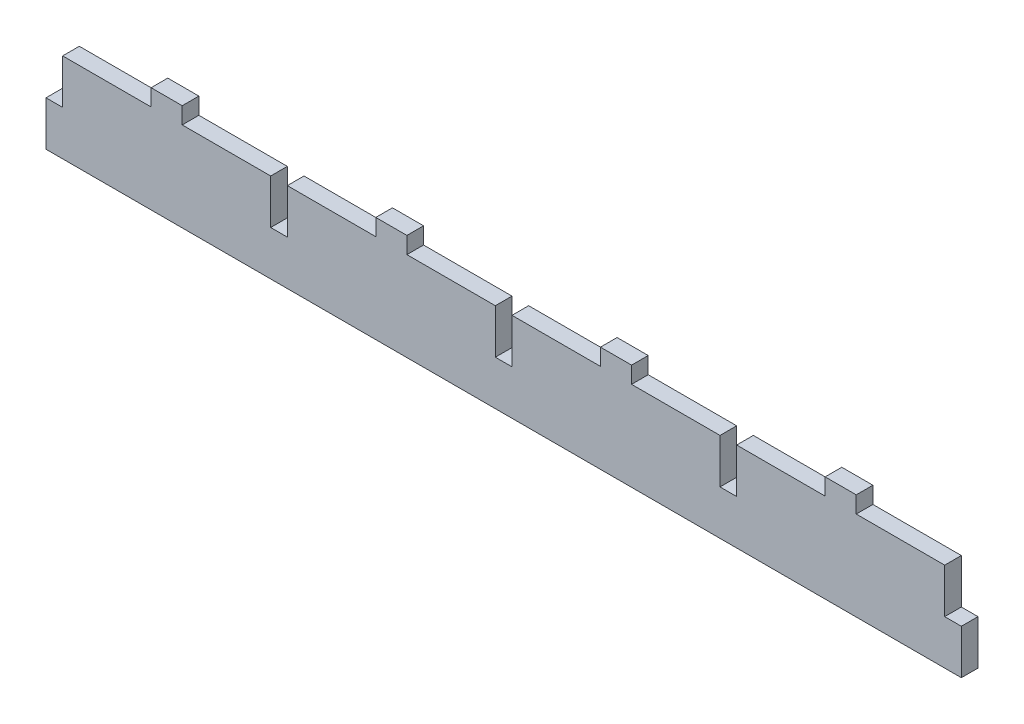
ISO-10303-21;
HEADER;
FILE_DESCRIPTION(('STEP AP214'),'2;1');
FILE_NAME('part.step','',(''),(''),'','','');
FILE_SCHEMA(('AUTOMOTIVE_DESIGN { 1 0 10303 214 1 1 1 1 }'));
ENDSEC;
DATA;
#1=APPLICATION_CONTEXT('core data for automotive mechanical design processes');
#2=APPLICATION_PROTOCOL_DEFINITION('international standard','automotive_design',2000,#1);
#3=PRODUCT_CONTEXT('',#1,'mechanical');
#4=PRODUCT('Part','Part','',(#3));
#5=PRODUCT_RELATED_PRODUCT_CATEGORY('part','',(#4));
#6=PRODUCT_DEFINITION_FORMATION('','',#4);
#7=PRODUCT_DEFINITION_CONTEXT('part definition',#1,'design');
#8=PRODUCT_DEFINITION('design','',#6,#7);
#9=PRODUCT_DEFINITION_SHAPE('','',#8);
#10=(LENGTH_UNIT() NAMED_UNIT(*) SI_UNIT(.MILLI.,.METRE.));
#11=(NAMED_UNIT(*) PLANE_ANGLE_UNIT() SI_UNIT($,.RADIAN.));
#12=(NAMED_UNIT(*) SI_UNIT($,.STERADIAN.) SOLID_ANGLE_UNIT());
#13=UNCERTAINTY_MEASURE_WITH_UNIT(LENGTH_MEASURE(1.E-05),#10,'distance_accuracy_value','');
#14=(GEOMETRIC_REPRESENTATION_CONTEXT(3) GLOBAL_UNCERTAINTY_ASSIGNED_CONTEXT((#13)) GLOBAL_UNIT_ASSIGNED_CONTEXT((#10,
#11,#12)) REPRESENTATION_CONTEXT('',''));
#15=CARTESIAN_POINT('',(0.,0.,0.));
#16=DIRECTION('',(0.,0.,1.));
#17=DIRECTION('',(1.,0.,0.));
#18=AXIS2_PLACEMENT_3D('',#15,#16,#17);
#19=CARTESIAN_POINT('',(-147.,0.,5.35));
#20=DIRECTION('',(1.,0.,0.));
#21=DIRECTION('',(0.,0.,-1.));
#22=AXIS2_PLACEMENT_3D('',#19,#20,#21);
#23=PLANE('',#22);
#24=DIRECTION('',(0.,-1.,0.));
#25=VECTOR('',#24,1.);
#26=CARTESIAN_POINT('',(-147.,0.,0.));
#27=LINE('',#26,#25);
#28=CARTESIAN_POINT('',(-147.,14.32,0.));
#29=VERTEX_POINT('',#28);
#30=CARTESIAN_POINT('',(-147.,0.,0.));
#31=VERTEX_POINT('',#30);
#32=EDGE_CURVE('E296',#29,#31,#27,.T.);
#33=ORIENTED_EDGE('',*,*,#32,.T.);
#34=DIRECTION('',(0.,0.,-1.));
#35=VECTOR('',#34,1.);
#36=CARTESIAN_POINT('',(-147.,0.,5.35));
#37=LINE('',#36,#35);
#38=CARTESIAN_POINT('',(-147.,0.,5.35));
#39=VERTEX_POINT('',#38);
#40=EDGE_CURVE('E11',#39,#31,#37,.T.);
#41=ORIENTED_EDGE('',*,*,#40,.F.);
#42=DIRECTION('',(0.,-1.,0.));
#43=VECTOR('',#42,1.);
#44=CARTESIAN_POINT('',(-147.,0.,5.35));
#45=LINE('',#44,#43);
#46=CARTESIAN_POINT('',(-147.,14.32,5.35));
#47=VERTEX_POINT('',#46);
#48=EDGE_CURVE('E366',#47,#39,#45,.T.);
#49=ORIENTED_EDGE('',*,*,#48,.F.);
#50=DIRECTION('',(0.,0.,-1.));
#51=VECTOR('',#50,1.);
#52=CARTESIAN_POINT('',(-147.,14.32,5.35));
#53=LINE('',#52,#51);
#54=EDGE_CURVE('E292',#47,#29,#53,.T.);
#55=ORIENTED_EDGE('',*,*,#54,.T.);
#56=EDGE_LOOP('',(#33,#41,#49,#55));
#57=FACE_BOUND('',#56,.T.);
#58=ADVANCED_FACE('F32',(#57),#23,.F.);
#59=CARTESIAN_POINT('',(-147.,0.,5.35));
#60=DIRECTION('',(0.,1.,0.));
#61=DIRECTION('',(0.,0.,1.));
#62=AXIS2_PLACEMENT_3D('',#59,#60,#61);
#63=PLANE('',#62);
#64=DIRECTION('',(1.,0.,0.));
#65=VECTOR('',#64,1.);
#66=CARTESIAN_POINT('',(-147.,0.,0.));
#67=LINE('',#66,#65);
#68=CARTESIAN_POINT('',(147.,0.,0.));
#69=VERTEX_POINT('',#68);
#70=EDGE_CURVE('E299',#31,#69,#67,.T.);
#71=ORIENTED_EDGE('',*,*,#70,.T.);
#72=DIRECTION('',(0.,0.,-1.));
#73=VECTOR('',#72,1.);
#74=CARTESIAN_POINT('',(147.,0.,5.35));
#75=LINE('',#74,#73);
#76=CARTESIAN_POINT('',(147.,0.,5.35));
#77=VERTEX_POINT('',#76);
#78=EDGE_CURVE('E40',#77,#69,#75,.T.);
#79=ORIENTED_EDGE('',*,*,#78,.F.);
#80=DIRECTION('',(1.,0.,0.));
#81=VECTOR('',#80,1.);
#82=CARTESIAN_POINT('',(-147.,0.,5.35));
#83=LINE('',#82,#81);
#84=EDGE_CURVE('E175',#39,#77,#83,.T.);
#85=ORIENTED_EDGE('',*,*,#84,.F.);
#86=ORIENTED_EDGE('',*,*,#40,.T.);
#87=EDGE_LOOP('',(#71,#79,#85,#86));
#88=FACE_BOUND('',#87,.T.);
#89=ADVANCED_FACE('F564',(#88),#63,.F.);
#90=CARTESIAN_POINT('',(147.,0.,5.35));
#91=DIRECTION('',(-1.,0.,0.));
#92=DIRECTION('',(0.,0.,1.));
#93=AXIS2_PLACEMENT_3D('',#90,#91,#92);
#94=PLANE('',#93);
#95=DIRECTION('',(0.,1.,0.));
#96=VECTOR('',#95,1.);
#97=CARTESIAN_POINT('',(147.,0.,0.));
#98=LINE('',#97,#96);
#99=CARTESIAN_POINT('',(147.,14.32,0.));
#100=VERTEX_POINT('',#99);
#101=EDGE_CURVE('E301',#69,#100,#98,.T.);
#102=ORIENTED_EDGE('',*,*,#101,.T.);
#103=DIRECTION('',(0.,0.,-1.));
#104=VECTOR('',#103,1.);
#105=CARTESIAN_POINT('',(147.,14.32,5.35));
#106=LINE('',#105,#104);
#107=CARTESIAN_POINT('',(147.,14.32,5.35));
#108=VERTEX_POINT('',#107);
#109=EDGE_CURVE('E457',#108,#100,#106,.T.);
#110=ORIENTED_EDGE('',*,*,#109,.F.);
#111=DIRECTION('',(0.,1.,0.));
#112=VECTOR('',#111,1.);
#113=CARTESIAN_POINT('',(147.,0.,5.35));
#114=LINE('',#113,#112);
#115=EDGE_CURVE('E465',#77,#108,#114,.T.);
#116=ORIENTED_EDGE('',*,*,#115,.F.);
#117=ORIENTED_EDGE('',*,*,#78,.T.);
#118=EDGE_LOOP('',(#102,#110,#116,#117));
#119=FACE_BOUND('',#118,.T.);
#120=ADVANCED_FACE('F463',(#119),#94,.F.);
#121=CARTESIAN_POINT('',(147.,14.32,5.35));
#122=DIRECTION('',(0.,-1.,0.));
#123=DIRECTION('',(0.,0.,-1.));
#124=AXIS2_PLACEMENT_3D('',#121,#122,#123);
#125=PLANE('',#124);
#126=DIRECTION('',(-1.,0.,0.));
#127=VECTOR('',#126,1.);
#128=CARTESIAN_POINT('',(147.,14.32,0.));
#129=LINE('',#128,#127);
#130=CARTESIAN_POINT('',(141.65,14.32,0.));
#131=VERTEX_POINT('',#130);
#132=EDGE_CURVE('E303',#100,#131,#129,.T.);
#133=ORIENTED_EDGE('',*,*,#132,.T.);
#134=DIRECTION('',(0.,0.,-1.));
#135=VECTOR('',#134,1.);
#136=CARTESIAN_POINT('',(141.65,14.32,5.35));
#137=LINE('',#136,#135);
#138=CARTESIAN_POINT('',(141.65,14.32,5.35));
#139=VERTEX_POINT('',#138);
#140=EDGE_CURVE('E454',#139,#131,#137,.T.);
#141=ORIENTED_EDGE('',*,*,#140,.F.);
#142=DIRECTION('',(-1.,0.,0.));
#143=VECTOR('',#142,1.);
#144=CARTESIAN_POINT('',(147.,14.32,5.35));
#145=LINE('',#144,#143);
#146=EDGE_CURVE('E483',#108,#139,#145,.T.);
#147=ORIENTED_EDGE('',*,*,#146,.F.);
#148=ORIENTED_EDGE('',*,*,#109,.T.);
#149=EDGE_LOOP('',(#133,#141,#147,#148));
#150=FACE_BOUND('',#149,.T.);
#151=ADVANCED_FACE('F474',(#150),#125,.F.);
#152=CARTESIAN_POINT('',(141.65,14.32,5.35));
#153=DIRECTION('',(-1.,0.,0.));
#154=DIRECTION('',(0.,-1.,0.));
#155=AXIS2_PLACEMENT_3D('',#152,#153,#154);
#156=PLANE('',#155);
#157=DIRECTION('',(0.,1.,0.));
#158=VECTOR('',#157,1.);
#159=CARTESIAN_POINT('',(141.65,14.32,0.));
#160=LINE('',#159,#158);
#161=CARTESIAN_POINT('',(141.65,28.65,0.));
#162=VERTEX_POINT('',#161);
#163=EDGE_CURVE('E305',#131,#162,#160,.T.);
#164=ORIENTED_EDGE('',*,*,#163,.T.);
#165=DIRECTION('',(0.,0.,-1.));
#166=VECTOR('',#165,1.);
#167=CARTESIAN_POINT('',(141.65,28.65,5.35));
#168=LINE('',#167,#166);
#169=CARTESIAN_POINT('',(141.65,28.65,5.35));
#170=VERTEX_POINT('',#169);
#171=EDGE_CURVE('E451',#170,#162,#168,.T.);
#172=ORIENTED_EDGE('',*,*,#171,.F.);
#173=DIRECTION('',(0.,1.,0.));
#174=VECTOR('',#173,1.);
#175=CARTESIAN_POINT('',(141.65,14.32,5.35));
#176=LINE('',#175,#174);
#177=EDGE_CURVE('E480',#139,#170,#176,.T.);
#178=ORIENTED_EDGE('',*,*,#177,.F.);
#179=ORIENTED_EDGE('',*,*,#140,.T.);
#180=EDGE_LOOP('',(#164,#172,#178,#179));
#181=FACE_BOUND('',#180,.T.);
#182=ADVANCED_FACE('F478',(#181),#156,.F.);
#183=CARTESIAN_POINT('',(113.24375,28.65,5.35));
#184=DIRECTION('',(0.,-1.,0.));
#185=DIRECTION('',(0.,0.,-1.));
#186=AXIS2_PLACEMENT_3D('',#183,#184,#185);
#187=PLANE('',#186);
#188=DIRECTION('',(-1.,0.,0.));
#189=VECTOR('',#188,1.);
#190=CARTESIAN_POINT('',(113.24375,28.65,0.));
#191=LINE('',#190,#189);
#192=CARTESIAN_POINT('',(113.24375,28.65,0.));
#193=VERTEX_POINT('',#192);
#194=EDGE_CURVE('E307',#162,#193,#191,.T.);
#195=ORIENTED_EDGE('',*,*,#194,.T.);
#196=DIRECTION('',(0.,0.,-1.));
#197=VECTOR('',#196,1.);
#198=CARTESIAN_POINT('',(113.24375,28.65,5.35));
#199=LINE('',#198,#197);
#200=CARTESIAN_POINT('',(113.24375,28.65,5.35));
#201=VERTEX_POINT('',#200);
#202=EDGE_CURVE('E448',#201,#193,#199,.T.);
#203=ORIENTED_EDGE('',*,*,#202,.F.);
#204=DIRECTION('',(-1.,0.,0.));
#205=VECTOR('',#204,1.);
#206=CARTESIAN_POINT('',(113.24375,28.65,5.35));
#207=LINE('',#206,#205);
#208=EDGE_CURVE('E482',#170,#201,#207,.T.);
#209=ORIENTED_EDGE('',*,*,#208,.F.);
#210=ORIENTED_EDGE('',*,*,#171,.T.);
#211=EDGE_LOOP('',(#195,#203,#209,#210));
#212=FACE_BOUND('',#211,.T.);
#213=ADVANCED_FACE('F577',(#212),#187,.F.);
#214=CARTESIAN_POINT('',(113.24375,28.65,5.35));
#215=DIRECTION('',(-1.,0.,0.));
#216=DIRECTION('',(0.,-1.,0.));
#217=AXIS2_PLACEMENT_3D('',#214,#215,#216);
#218=PLANE('',#217);
#219=DIRECTION('',(0.,1.,0.));
#220=VECTOR('',#219,1.);
#221=CARTESIAN_POINT('',(113.24375,28.65,0.));
#222=LINE('',#221,#220);
#223=CARTESIAN_POINT('',(113.24375,34.,0.));
#224=VERTEX_POINT('',#223);
#225=EDGE_CURVE('E309',#193,#224,#222,.T.);
#226=ORIENTED_EDGE('',*,*,#225,.T.);
#227=DIRECTION('',(0.,0.,-1.));
#228=VECTOR('',#227,1.);
#229=CARTESIAN_POINT('',(113.24375,34.,5.35));
#230=LINE('',#229,#228);
#231=CARTESIAN_POINT('',(113.24375,34.,5.35));
#232=VERTEX_POINT('',#231);
#233=EDGE_CURVE('E445',#232,#224,#230,.T.);
#234=ORIENTED_EDGE('',*,*,#233,.F.);
#235=DIRECTION('',(0.,1.,0.));
#236=VECTOR('',#235,1.);
#237=CARTESIAN_POINT('',(113.24375,28.65,5.35));
#238=LINE('',#237,#236);
#239=EDGE_CURVE('E485',#201,#232,#238,.T.);
#240=ORIENTED_EDGE('',*,*,#239,.F.);
#241=ORIENTED_EDGE('',*,*,#202,.T.);
#242=EDGE_LOOP('',(#226,#234,#240,#241));
#243=FACE_BOUND('',#242,.T.);
#244=ADVANCED_FACE('F580',(#243),#218,.F.);
#245=CARTESIAN_POINT('',(113.24375,34.,5.35));
#246=DIRECTION('',(0.,-1.,0.));
#247=DIRECTION('',(0.,0.,-1.));
#248=AXIS2_PLACEMENT_3D('',#245,#246,#247);
#249=PLANE('',#248);
#250=DIRECTION('',(-1.,0.,0.));
#251=VECTOR('',#250,1.);
#252=CARTESIAN_POINT('',(113.24375,34.,0.));
#253=LINE('',#252,#251);
#254=CARTESIAN_POINT('',(103.24375,34.,0.));
#255=VERTEX_POINT('',#254);
#256=EDGE_CURVE('E311',#224,#255,#253,.T.);
#257=ORIENTED_EDGE('',*,*,#256,.T.);
#258=DIRECTION('',(0.,0.,-1.));
#259=VECTOR('',#258,1.);
#260=CARTESIAN_POINT('',(103.24375,34.,5.35));
#261=LINE('',#260,#259);
#262=CARTESIAN_POINT('',(103.24375,34.,5.35));
#263=VERTEX_POINT('',#262);
#264=EDGE_CURVE('E442',#263,#255,#261,.T.);
#265=ORIENTED_EDGE('',*,*,#264,.F.);
#266=DIRECTION('',(-1.,0.,0.));
#267=VECTOR('',#266,1.);
#268=CARTESIAN_POINT('',(113.24375,34.,5.35));
#269=LINE('',#268,#267);
#270=EDGE_CURVE('E491',#232,#263,#269,.T.);
#271=ORIENTED_EDGE('',*,*,#270,.F.);
#272=ORIENTED_EDGE('',*,*,#233,.T.);
#273=EDGE_LOOP('',(#257,#265,#271,#272));
#274=FACE_BOUND('',#273,.T.);
#275=ADVANCED_FACE('F584',(#274),#249,.F.);
#276=CARTESIAN_POINT('',(103.24375,28.65,5.35));
#277=DIRECTION('',(1.,0.,0.));
#278=DIRECTION('',(0.,1.,0.));
#279=AXIS2_PLACEMENT_3D('',#276,#277,#278);
#280=PLANE('',#279);
#281=DIRECTION('',(0.,-1.,0.));
#282=VECTOR('',#281,1.);
#283=CARTESIAN_POINT('',(103.24375,28.65,0.));
#284=LINE('',#283,#282);
#285=CARTESIAN_POINT('',(103.24375,28.65,0.));
#286=VERTEX_POINT('',#285);
#287=EDGE_CURVE('E313',#255,#286,#284,.T.);
#288=ORIENTED_EDGE('',*,*,#287,.T.);
#289=DIRECTION('',(0.,0.,-1.));
#290=VECTOR('',#289,1.);
#291=CARTESIAN_POINT('',(103.24375,28.65,5.35));
#292=LINE('',#291,#290);
#293=CARTESIAN_POINT('',(103.24375,28.65,5.35));
#294=VERTEX_POINT('',#293);
#295=EDGE_CURVE('E439',#294,#286,#292,.T.);
#296=ORIENTED_EDGE('',*,*,#295,.F.);
#297=DIRECTION('',(0.,-1.,0.));
#298=VECTOR('',#297,1.);
#299=CARTESIAN_POINT('',(103.24375,28.65,5.35));
#300=LINE('',#299,#298);
#301=EDGE_CURVE('E493',#263,#294,#300,.T.);
#302=ORIENTED_EDGE('',*,*,#301,.F.);
#303=ORIENTED_EDGE('',*,*,#264,.T.);
#304=EDGE_LOOP('',(#288,#296,#302,#303));
#305=FACE_BOUND('',#304,.T.);
#306=ADVANCED_FACE('F588',(#305),#280,.F.);
#307=CARTESIAN_POINT('',(74.8375,28.65,5.35));
#308=DIRECTION('',(0.,-1.,0.));
#309=DIRECTION('',(0.,0.,-1.));
#310=AXIS2_PLACEMENT_3D('',#307,#308,#309);
#311=PLANE('',#310);
#312=DIRECTION('',(-1.,0.,0.));
#313=VECTOR('',#312,1.);
#314=CARTESIAN_POINT('',(74.8375,28.65,0.));
#315=LINE('',#314,#313);
#316=CARTESIAN_POINT('',(74.8375,28.65,0.));
#317=VERTEX_POINT('',#316);
#318=EDGE_CURVE('E315',#286,#317,#315,.T.);
#319=ORIENTED_EDGE('',*,*,#318,.T.);
#320=DIRECTION('',(0.,0.,-1.));
#321=VECTOR('',#320,1.);
#322=CARTESIAN_POINT('',(74.8375,28.65,5.35));
#323=LINE('',#322,#321);
#324=CARTESIAN_POINT('',(74.8375,28.65,5.35));
#325=VERTEX_POINT('',#324);
#326=EDGE_CURVE('E436',#325,#317,#323,.T.);
#327=ORIENTED_EDGE('',*,*,#326,.F.);
#328=DIRECTION('',(-1.,0.,0.));
#329=VECTOR('',#328,1.);
#330=CARTESIAN_POINT('',(74.8375,28.65,5.35));
#331=LINE('',#330,#329);
#332=EDGE_CURVE('E495',#294,#325,#331,.T.);
#333=ORIENTED_EDGE('',*,*,#332,.F.);
#334=ORIENTED_EDGE('',*,*,#295,.T.);
#335=EDGE_LOOP('',(#319,#327,#333,#334));
#336=FACE_BOUND('',#335,.T.);
#337=ADVANCED_FACE('F592',(#336),#311,.F.);
#338=CARTESIAN_POINT('',(74.8375,28.65,5.35));
#339=DIRECTION('',(1.,0.,0.));
#340=DIRECTION('',(0.,1.,0.));
#341=AXIS2_PLACEMENT_3D('',#338,#339,#340);
#342=PLANE('',#341);
#343=DIRECTION('',(0.,-1.,0.));
#344=VECTOR('',#343,1.);
#345=CARTESIAN_POINT('',(74.8375,28.65,0.));
#346=LINE('',#345,#344);
#347=CARTESIAN_POINT('',(74.8375,14.32,0.));
#348=VERTEX_POINT('',#347);
#349=EDGE_CURVE('E317',#317,#348,#346,.T.);
#350=ORIENTED_EDGE('',*,*,#349,.T.);
#351=DIRECTION('',(0.,0.,-1.));
#352=VECTOR('',#351,1.);
#353=CARTESIAN_POINT('',(74.8375,14.32,5.35));
#354=LINE('',#353,#352);
#355=CARTESIAN_POINT('',(74.8375,14.32,5.35));
#356=VERTEX_POINT('',#355);
#357=EDGE_CURVE('E433',#356,#348,#354,.T.);
#358=ORIENTED_EDGE('',*,*,#357,.F.);
#359=DIRECTION('',(0.,-1.,0.));
#360=VECTOR('',#359,1.);
#361=CARTESIAN_POINT('',(74.8375,28.65,5.35));
#362=LINE('',#361,#360);
#363=EDGE_CURVE('E497',#325,#356,#362,.T.);
#364=ORIENTED_EDGE('',*,*,#363,.F.);
#365=ORIENTED_EDGE('',*,*,#326,.T.);
#366=EDGE_LOOP('',(#350,#358,#364,#365));
#367=FACE_BOUND('',#366,.T.);
#368=ADVANCED_FACE('F596',(#367),#342,.F.);
#369=CARTESIAN_POINT('',(74.8375,14.32,5.35));
#370=DIRECTION('',(0.,-1.,0.));
#371=DIRECTION('',(0.,0.,-1.));
#372=AXIS2_PLACEMENT_3D('',#369,#370,#371);
#373=PLANE('',#372);
#374=DIRECTION('',(-1.,0.,0.));
#375=VECTOR('',#374,1.);
#376=CARTESIAN_POINT('',(74.8375,14.32,0.));
#377=LINE('',#376,#375);
#378=CARTESIAN_POINT('',(69.4875,14.32,0.));
#379=VERTEX_POINT('',#378);
#380=EDGE_CURVE('E319',#348,#379,#377,.T.);
#381=ORIENTED_EDGE('',*,*,#380,.T.);
#382=DIRECTION('',(0.,0.,-1.));
#383=VECTOR('',#382,1.);
#384=CARTESIAN_POINT('',(69.4875,14.32,5.35));
#385=LINE('',#384,#383);
#386=CARTESIAN_POINT('',(69.4875,14.32,5.35));
#387=VERTEX_POINT('',#386);
#388=EDGE_CURVE('E430',#387,#379,#385,.T.);
#389=ORIENTED_EDGE('',*,*,#388,.F.);
#390=DIRECTION('',(-1.,0.,0.));
#391=VECTOR('',#390,1.);
#392=CARTESIAN_POINT('',(74.8375,14.32,5.35));
#393=LINE('',#392,#391);
#394=EDGE_CURVE('E499',#356,#387,#393,.T.);
#395=ORIENTED_EDGE('',*,*,#394,.F.);
#396=ORIENTED_EDGE('',*,*,#357,.T.);
#397=EDGE_LOOP('',(#381,#389,#395,#396));
#398=FACE_BOUND('',#397,.T.);
#399=ADVANCED_FACE('F600',(#398),#373,.F.);
#400=CARTESIAN_POINT('',(69.4875,28.65,5.35));
#401=DIRECTION('',(-1.,0.,0.));
#402=DIRECTION('',(0.,0.,1.));
#403=AXIS2_PLACEMENT_3D('',#400,#401,#402);
#404=PLANE('',#403);
#405=DIRECTION('',(0.,1.,0.));
#406=VECTOR('',#405,1.);
#407=CARTESIAN_POINT('',(69.4875,28.65,0.));
#408=LINE('',#407,#406);
#409=CARTESIAN_POINT('',(69.4875,28.65,0.));
#410=VERTEX_POINT('',#409);
#411=EDGE_CURVE('E321',#379,#410,#408,.T.);
#412=ORIENTED_EDGE('',*,*,#411,.T.);
#413=DIRECTION('',(0.,0.,-1.));
#414=VECTOR('',#413,1.);
#415=CARTESIAN_POINT('',(69.4875,28.65,5.35));
#416=LINE('',#415,#414);
#417=CARTESIAN_POINT('',(69.4875,28.65,5.35));
#418=VERTEX_POINT('',#417);
#419=EDGE_CURVE('E427',#418,#410,#416,.T.);
#420=ORIENTED_EDGE('',*,*,#419,.F.);
#421=DIRECTION('',(0.,1.,0.));
#422=VECTOR('',#421,1.);
#423=CARTESIAN_POINT('',(69.4875,28.65,5.35));
#424=LINE('',#423,#422);
#425=EDGE_CURVE('E501',#387,#418,#424,.T.);
#426=ORIENTED_EDGE('',*,*,#425,.F.);
#427=ORIENTED_EDGE('',*,*,#388,.T.);
#428=EDGE_LOOP('',(#412,#420,#426,#427));
#429=FACE_BOUND('',#428,.T.);
#430=ADVANCED_FACE('F604',(#429),#404,.F.);
#431=CARTESIAN_POINT('',(41.08125,28.65,5.35));
#432=DIRECTION('',(0.,-1.,0.));
#433=DIRECTION('',(0.,0.,-1.));
#434=AXIS2_PLACEMENT_3D('',#431,#432,#433);
#435=PLANE('',#434);
#436=DIRECTION('',(-1.,0.,0.));
#437=VECTOR('',#436,1.);
#438=CARTESIAN_POINT('',(41.08125,28.65,0.));
#439=LINE('',#438,#437);
#440=CARTESIAN_POINT('',(41.08125,28.65,0.));
#441=VERTEX_POINT('',#440);
#442=EDGE_CURVE('E323',#410,#441,#439,.T.);
#443=ORIENTED_EDGE('',*,*,#442,.T.);
#444=DIRECTION('',(0.,0.,-1.));
#445=VECTOR('',#444,1.);
#446=CARTESIAN_POINT('',(41.08125,28.65,5.35));
#447=LINE('',#446,#445);
#448=CARTESIAN_POINT('',(41.08125,28.65,5.35));
#449=VERTEX_POINT('',#448);
#450=EDGE_CURVE('E424',#449,#441,#447,.T.);
#451=ORIENTED_EDGE('',*,*,#450,.F.);
#452=DIRECTION('',(-1.,0.,0.));
#453=VECTOR('',#452,1.);
#454=CARTESIAN_POINT('',(41.08125,28.65,5.35));
#455=LINE('',#454,#453);
#456=EDGE_CURVE('E503',#418,#449,#455,.T.);
#457=ORIENTED_EDGE('',*,*,#456,.F.);
#458=ORIENTED_EDGE('',*,*,#419,.T.);
#459=EDGE_LOOP('',(#443,#451,#457,#458));
#460=FACE_BOUND('',#459,.T.);
#461=ADVANCED_FACE('F608',(#460),#435,.F.);
#462=CARTESIAN_POINT('',(41.08125,28.65,5.35));
#463=DIRECTION('',(-1.,0.,0.));
#464=DIRECTION('',(0.,-1.,0.));
#465=AXIS2_PLACEMENT_3D('',#462,#463,#464);
#466=PLANE('',#465);
#467=DIRECTION('',(0.,1.,0.));
#468=VECTOR('',#467,1.);
#469=CARTESIAN_POINT('',(41.08125,28.65,0.));
#470=LINE('',#469,#468);
#471=CARTESIAN_POINT('',(41.08125,34.,0.));
#472=VERTEX_POINT('',#471);
#473=EDGE_CURVE('E325',#441,#472,#470,.T.);
#474=ORIENTED_EDGE('',*,*,#473,.T.);
#475=DIRECTION('',(0.,0.,-1.));
#476=VECTOR('',#475,1.);
#477=CARTESIAN_POINT('',(41.08125,34.,5.35));
#478=LINE('',#477,#476);
#479=CARTESIAN_POINT('',(41.08125,34.,5.35));
#480=VERTEX_POINT('',#479);
#481=EDGE_CURVE('E421',#480,#472,#478,.T.);
#482=ORIENTED_EDGE('',*,*,#481,.F.);
#483=DIRECTION('',(0.,1.,0.));
#484=VECTOR('',#483,1.);
#485=CARTESIAN_POINT('',(41.08125,28.65,5.35));
#486=LINE('',#485,#484);
#487=EDGE_CURVE('E505',#449,#480,#486,.T.);
#488=ORIENTED_EDGE('',*,*,#487,.F.);
#489=ORIENTED_EDGE('',*,*,#450,.T.);
#490=EDGE_LOOP('',(#474,#482,#488,#489));
#491=FACE_BOUND('',#490,.T.);
#492=ADVANCED_FACE('F612',(#491),#466,.F.);
#493=CARTESIAN_POINT('',(41.08125,34.,5.35));
#494=DIRECTION('',(0.,-1.,0.));
#495=DIRECTION('',(0.,0.,-1.));
#496=AXIS2_PLACEMENT_3D('',#493,#494,#495);
#497=PLANE('',#496);
#498=DIRECTION('',(-1.,0.,0.));
#499=VECTOR('',#498,1.);
#500=CARTESIAN_POINT('',(41.08125,34.,0.));
#501=LINE('',#500,#499);
#502=CARTESIAN_POINT('',(31.08125,34.,0.));
#503=VERTEX_POINT('',#502);
#504=EDGE_CURVE('E327',#472,#503,#501,.T.);
#505=ORIENTED_EDGE('',*,*,#504,.T.);
#506=DIRECTION('',(0.,0.,-1.));
#507=VECTOR('',#506,1.);
#508=CARTESIAN_POINT('',(31.08125,34.,5.35));
#509=LINE('',#508,#507);
#510=CARTESIAN_POINT('',(31.08125,34.,5.35));
#511=VERTEX_POINT('',#510);
#512=EDGE_CURVE('E418',#511,#503,#509,.T.);
#513=ORIENTED_EDGE('',*,*,#512,.F.);
#514=DIRECTION('',(-1.,0.,0.));
#515=VECTOR('',#514,1.);
#516=CARTESIAN_POINT('',(41.08125,34.,5.35));
#517=LINE('',#516,#515);
#518=EDGE_CURVE('E507',#480,#511,#517,.T.);
#519=ORIENTED_EDGE('',*,*,#518,.F.);
#520=ORIENTED_EDGE('',*,*,#481,.T.);
#521=EDGE_LOOP('',(#505,#513,#519,#520));
#522=FACE_BOUND('',#521,.T.);
#523=ADVANCED_FACE('F616',(#522),#497,.F.);
#524=CARTESIAN_POINT('',(31.08125,28.65,5.35));
#525=DIRECTION('',(1.,0.,0.));
#526=DIRECTION('',(0.,1.,0.));
#527=AXIS2_PLACEMENT_3D('',#524,#525,#526);
#528=PLANE('',#527);
#529=DIRECTION('',(0.,-1.,0.));
#530=VECTOR('',#529,1.);
#531=CARTESIAN_POINT('',(31.08125,28.65,0.));
#532=LINE('',#531,#530);
#533=CARTESIAN_POINT('',(31.08125,28.65,0.));
#534=VERTEX_POINT('',#533);
#535=EDGE_CURVE('E329',#503,#534,#532,.T.);
#536=ORIENTED_EDGE('',*,*,#535,.T.);
#537=DIRECTION('',(0.,0.,-1.));
#538=VECTOR('',#537,1.);
#539=CARTESIAN_POINT('',(31.08125,28.65,5.35));
#540=LINE('',#539,#538);
#541=CARTESIAN_POINT('',(31.08125,28.65,5.35));
#542=VERTEX_POINT('',#541);
#543=EDGE_CURVE('E415',#542,#534,#540,.T.);
#544=ORIENTED_EDGE('',*,*,#543,.F.);
#545=DIRECTION('',(0.,-1.,0.));
#546=VECTOR('',#545,1.);
#547=CARTESIAN_POINT('',(31.08125,28.65,5.35));
#548=LINE('',#547,#546);
#549=EDGE_CURVE('E509',#511,#542,#548,.T.);
#550=ORIENTED_EDGE('',*,*,#549,.F.);
#551=ORIENTED_EDGE('',*,*,#512,.T.);
#552=EDGE_LOOP('',(#536,#544,#550,#551));
#553=FACE_BOUND('',#552,.T.);
#554=ADVANCED_FACE('F620',(#553),#528,.F.);
#555=CARTESIAN_POINT('',(2.67499999999998,28.65,5.35));
#556=DIRECTION('',(0.,-1.,0.));
#557=DIRECTION('',(0.,0.,-1.));
#558=AXIS2_PLACEMENT_3D('',#555,#556,#557);
#559=PLANE('',#558);
#560=DIRECTION('',(-1.,0.,0.));
#561=VECTOR('',#560,1.);
#562=CARTESIAN_POINT('',(2.67499999999998,28.65,0.));
#563=LINE('',#562,#561);
#564=CARTESIAN_POINT('',(2.67499999999998,28.65,0.));
#565=VERTEX_POINT('',#564);
#566=EDGE_CURVE('E331',#534,#565,#563,.T.);
#567=ORIENTED_EDGE('',*,*,#566,.T.);
#568=DIRECTION('',(0.,0.,-1.));
#569=VECTOR('',#568,1.);
#570=CARTESIAN_POINT('',(2.67499999999998,28.65,5.35));
#571=LINE('',#570,#569);
#572=CARTESIAN_POINT('',(2.67499999999998,28.65,5.35));
#573=VERTEX_POINT('',#572);
#574=EDGE_CURVE('E412',#573,#565,#571,.T.);
#575=ORIENTED_EDGE('',*,*,#574,.F.);
#576=DIRECTION('',(-1.,0.,0.));
#577=VECTOR('',#576,1.);
#578=CARTESIAN_POINT('',(2.67499999999998,28.65,5.35));
#579=LINE('',#578,#577);
#580=EDGE_CURVE('E511',#542,#573,#579,.T.);
#581=ORIENTED_EDGE('',*,*,#580,.F.);
#582=ORIENTED_EDGE('',*,*,#543,.T.);
#583=EDGE_LOOP('',(#567,#575,#581,#582));
#584=FACE_BOUND('',#583,.T.);
#585=ADVANCED_FACE('F624',(#584),#559,.F.);
#586=CARTESIAN_POINT('',(2.67499999999998,28.65,5.35));
#587=DIRECTION('',(1.,0.,0.));
#588=DIRECTION('',(0.,1.,0.));
#589=AXIS2_PLACEMENT_3D('',#586,#587,#588);
#590=PLANE('',#589);
#591=DIRECTION('',(0.,-1.,0.));
#592=VECTOR('',#591,1.);
#593=CARTESIAN_POINT('',(2.67499999999998,28.65,0.));
#594=LINE('',#593,#592);
#595=CARTESIAN_POINT('',(2.67500000000001,14.32,0.));
#596=VERTEX_POINT('',#595);
#597=EDGE_CURVE('E333',#565,#596,#594,.T.);
#598=ORIENTED_EDGE('',*,*,#597,.T.);
#599=DIRECTION('',(0.,0.,-1.));
#600=VECTOR('',#599,1.);
#601=CARTESIAN_POINT('',(2.67500000000001,14.32,5.35));
#602=LINE('',#601,#600);
#603=CARTESIAN_POINT('',(2.67500000000001,14.32,5.35));
#604=VERTEX_POINT('',#603);
#605=EDGE_CURVE('E409',#604,#596,#602,.T.);
#606=ORIENTED_EDGE('',*,*,#605,.F.);
#607=DIRECTION('',(0.,-1.,0.));
#608=VECTOR('',#607,1.);
#609=CARTESIAN_POINT('',(2.67499999999998,28.65,5.35));
#610=LINE('',#609,#608);
#611=EDGE_CURVE('E513',#573,#604,#610,.T.);
#612=ORIENTED_EDGE('',*,*,#611,.F.);
#613=ORIENTED_EDGE('',*,*,#574,.T.);
#614=EDGE_LOOP('',(#598,#606,#612,#613));
#615=FACE_BOUND('',#614,.T.);
#616=ADVANCED_FACE('F628',(#615),#590,.F.);
#617=CARTESIAN_POINT('',(2.67500000000001,14.32,5.35));
#618=DIRECTION('',(0.,-1.,0.));
#619=DIRECTION('',(1.,0.,0.));
#620=AXIS2_PLACEMENT_3D('',#617,#618,#619);
#621=PLANE('',#620);
#622=DIRECTION('',(-1.,0.,0.));
#623=VECTOR('',#622,1.);
#624=CARTESIAN_POINT('',(2.67500000000001,14.32,0.));
#625=LINE('',#624,#623);
#626=CARTESIAN_POINT('',(-2.67499999999999,14.32,0.));
#627=VERTEX_POINT('',#626);
#628=EDGE_CURVE('E335',#596,#627,#625,.T.);
#629=ORIENTED_EDGE('',*,*,#628,.T.);
#630=DIRECTION('',(0.,0.,-1.));
#631=VECTOR('',#630,1.);
#632=CARTESIAN_POINT('',(-2.67499999999999,14.32,5.35));
#633=LINE('',#632,#631);
#634=CARTESIAN_POINT('',(-2.67499999999999,14.32,5.35));
#635=VERTEX_POINT('',#634);
#636=EDGE_CURVE('E406',#635,#627,#633,.T.);
#637=ORIENTED_EDGE('',*,*,#636,.F.);
#638=DIRECTION('',(-1.,0.,0.));
#639=VECTOR('',#638,1.);
#640=CARTESIAN_POINT('',(2.67500000000001,14.32,5.35));
#641=LINE('',#640,#639);
#642=EDGE_CURVE('E515',#604,#635,#641,.T.);
#643=ORIENTED_EDGE('',*,*,#642,.F.);
#644=ORIENTED_EDGE('',*,*,#605,.T.);
#645=EDGE_LOOP('',(#629,#637,#643,#644));
#646=FACE_BOUND('',#645,.T.);
#647=ADVANCED_FACE('F632',(#646),#621,.F.);
#648=CARTESIAN_POINT('',(-2.67499999999998,28.65,5.35));
#649=DIRECTION('',(-1.,0.,0.));
#650=DIRECTION('',(0.,-1.,0.));
#651=AXIS2_PLACEMENT_3D('',#648,#649,#650);
#652=PLANE('',#651);
#653=DIRECTION('',(0.,1.,0.));
#654=VECTOR('',#653,1.);
#655=CARTESIAN_POINT('',(-2.67499999999998,28.65,0.));
#656=LINE('',#655,#654);
#657=CARTESIAN_POINT('',(-2.67499999999998,28.65,0.));
#658=VERTEX_POINT('',#657);
#659=EDGE_CURVE('E337',#627,#658,#656,.T.);
#660=ORIENTED_EDGE('',*,*,#659,.T.);
#661=DIRECTION('',(0.,0.,-1.));
#662=VECTOR('',#661,1.);
#663=CARTESIAN_POINT('',(-2.67499999999998,28.65,5.35));
#664=LINE('',#663,#662);
#665=CARTESIAN_POINT('',(-2.67499999999998,28.65,5.35));
#666=VERTEX_POINT('',#665);
#667=EDGE_CURVE('E403',#666,#658,#664,.T.);
#668=ORIENTED_EDGE('',*,*,#667,.F.);
#669=DIRECTION('',(0.,1.,0.));
#670=VECTOR('',#669,1.);
#671=CARTESIAN_POINT('',(-2.67499999999998,28.65,5.35));
#672=LINE('',#671,#670);
#673=EDGE_CURVE('E517',#635,#666,#672,.T.);
#674=ORIENTED_EDGE('',*,*,#673,.F.);
#675=ORIENTED_EDGE('',*,*,#636,.T.);
#676=EDGE_LOOP('',(#660,#668,#674,#675));
#677=FACE_BOUND('',#676,.T.);
#678=ADVANCED_FACE('F636',(#677),#652,.F.);
#679=CARTESIAN_POINT('',(-31.08125,28.65,5.35));
#680=DIRECTION('',(0.,-1.,0.));
#681=DIRECTION('',(0.,0.,-1.));
#682=AXIS2_PLACEMENT_3D('',#679,#680,#681);
#683=PLANE('',#682);
#684=DIRECTION('',(-1.,0.,0.));
#685=VECTOR('',#684,1.);
#686=CARTESIAN_POINT('',(-31.08125,28.65,0.));
#687=LINE('',#686,#685);
#688=CARTESIAN_POINT('',(-31.08125,28.65,0.));
#689=VERTEX_POINT('',#688);
#690=EDGE_CURVE('E339',#658,#689,#687,.T.);
#691=ORIENTED_EDGE('',*,*,#690,.T.);
#692=DIRECTION('',(0.,0.,-1.));
#693=VECTOR('',#692,1.);
#694=CARTESIAN_POINT('',(-31.08125,28.65,5.35));
#695=LINE('',#694,#693);
#696=CARTESIAN_POINT('',(-31.08125,28.65,5.35));
#697=VERTEX_POINT('',#696);
#698=EDGE_CURVE('E400',#697,#689,#695,.T.);
#699=ORIENTED_EDGE('',*,*,#698,.F.);
#700=DIRECTION('',(-1.,0.,0.));
#701=VECTOR('',#700,1.);
#702=CARTESIAN_POINT('',(-31.08125,28.65,5.35));
#703=LINE('',#702,#701);
#704=EDGE_CURVE('E519',#666,#697,#703,.T.);
#705=ORIENTED_EDGE('',*,*,#704,.F.);
#706=ORIENTED_EDGE('',*,*,#667,.T.);
#707=EDGE_LOOP('',(#691,#699,#705,#706));
#708=FACE_BOUND('',#707,.T.);
#709=ADVANCED_FACE('F640',(#708),#683,.F.);
#710=CARTESIAN_POINT('',(-31.08125,28.65,5.35));
#711=DIRECTION('',(-1.,0.,0.));
#712=DIRECTION('',(0.,-1.,0.));
#713=AXIS2_PLACEMENT_3D('',#710,#711,#712);
#714=PLANE('',#713);
#715=DIRECTION('',(0.,1.,0.));
#716=VECTOR('',#715,1.);
#717=CARTESIAN_POINT('',(-31.08125,28.65,0.));
#718=LINE('',#717,#716);
#719=CARTESIAN_POINT('',(-31.08125,34.,0.));
#720=VERTEX_POINT('',#719);
#721=EDGE_CURVE('E341',#689,#720,#718,.T.);
#722=ORIENTED_EDGE('',*,*,#721,.T.);
#723=DIRECTION('',(0.,0.,-1.));
#724=VECTOR('',#723,1.);
#725=CARTESIAN_POINT('',(-31.08125,34.,5.35));
#726=LINE('',#725,#724);
#727=CARTESIAN_POINT('',(-31.08125,34.,5.35));
#728=VERTEX_POINT('',#727);
#729=EDGE_CURVE('E397',#728,#720,#726,.T.);
#730=ORIENTED_EDGE('',*,*,#729,.F.);
#731=DIRECTION('',(0.,1.,0.));
#732=VECTOR('',#731,1.);
#733=CARTESIAN_POINT('',(-31.08125,28.65,5.35));
#734=LINE('',#733,#732);
#735=EDGE_CURVE('E521',#697,#728,#734,.T.);
#736=ORIENTED_EDGE('',*,*,#735,.F.);
#737=ORIENTED_EDGE('',*,*,#698,.T.);
#738=EDGE_LOOP('',(#722,#730,#736,#737));
#739=FACE_BOUND('',#738,.T.);
#740=ADVANCED_FACE('F644',(#739),#714,.F.);
#741=CARTESIAN_POINT('',(-41.08125,34.,5.35));
#742=DIRECTION('',(0.,-1.,0.));
#743=DIRECTION('',(0.,0.,-1.));
#744=AXIS2_PLACEMENT_3D('',#741,#742,#743);
#745=PLANE('',#744);
#746=DIRECTION('',(-1.,0.,0.));
#747=VECTOR('',#746,1.);
#748=CARTESIAN_POINT('',(-41.08125,34.,0.));
#749=LINE('',#748,#747);
#750=CARTESIAN_POINT('',(-41.08125,34.,0.));
#751=VERTEX_POINT('',#750);
#752=EDGE_CURVE('E343',#720,#751,#749,.T.);
#753=ORIENTED_EDGE('',*,*,#752,.T.);
#754=DIRECTION('',(0.,0.,-1.));
#755=VECTOR('',#754,1.);
#756=CARTESIAN_POINT('',(-41.08125,34.,5.35));
#757=LINE('',#756,#755);
#758=CARTESIAN_POINT('',(-41.08125,34.,5.35));
#759=VERTEX_POINT('',#758);
#760=EDGE_CURVE('E394',#759,#751,#757,.T.);
#761=ORIENTED_EDGE('',*,*,#760,.F.);
#762=DIRECTION('',(-1.,0.,0.));
#763=VECTOR('',#762,1.);
#764=CARTESIAN_POINT('',(-41.08125,34.,5.35));
#765=LINE('',#764,#763);
#766=EDGE_CURVE('E523',#728,#759,#765,.T.);
#767=ORIENTED_EDGE('',*,*,#766,.F.);
#768=ORIENTED_EDGE('',*,*,#729,.T.);
#769=EDGE_LOOP('',(#753,#761,#767,#768));
#770=FACE_BOUND('',#769,.T.);
#771=ADVANCED_FACE('F648',(#770),#745,.F.);
#772=CARTESIAN_POINT('',(-41.08125,28.65,5.35));
#773=DIRECTION('',(1.,0.,0.));
#774=DIRECTION('',(0.,1.,0.));
#775=AXIS2_PLACEMENT_3D('',#772,#773,#774);
#776=PLANE('',#775);
#777=DIRECTION('',(0.,-1.,0.));
#778=VECTOR('',#777,1.);
#779=CARTESIAN_POINT('',(-41.08125,28.65,0.));
#780=LINE('',#779,#778);
#781=CARTESIAN_POINT('',(-41.08125,28.65,0.));
#782=VERTEX_POINT('',#781);
#783=EDGE_CURVE('E345',#751,#782,#780,.T.);
#784=ORIENTED_EDGE('',*,*,#783,.T.);
#785=DIRECTION('',(0.,0.,-1.));
#786=VECTOR('',#785,1.);
#787=CARTESIAN_POINT('',(-41.08125,28.65,5.35));
#788=LINE('',#787,#786);
#789=CARTESIAN_POINT('',(-41.08125,28.65,5.35));
#790=VERTEX_POINT('',#789);
#791=EDGE_CURVE('E391',#790,#782,#788,.T.);
#792=ORIENTED_EDGE('',*,*,#791,.F.);
#793=DIRECTION('',(0.,-1.,0.));
#794=VECTOR('',#793,1.);
#795=CARTESIAN_POINT('',(-41.08125,28.65,5.35));
#796=LINE('',#795,#794);
#797=EDGE_CURVE('E525',#759,#790,#796,.T.);
#798=ORIENTED_EDGE('',*,*,#797,.F.);
#799=ORIENTED_EDGE('',*,*,#760,.T.);
#800=EDGE_LOOP('',(#784,#792,#798,#799));
#801=FACE_BOUND('',#800,.T.);
#802=ADVANCED_FACE('F652',(#801),#776,.F.);
#803=CARTESIAN_POINT('',(-69.4875,28.65,5.35));
#804=DIRECTION('',(0.,-1.,0.));
#805=DIRECTION('',(0.,0.,-1.));
#806=AXIS2_PLACEMENT_3D('',#803,#804,#805);
#807=PLANE('',#806);
#808=DIRECTION('',(-1.,0.,0.));
#809=VECTOR('',#808,1.);
#810=CARTESIAN_POINT('',(-69.4875,28.65,0.));
#811=LINE('',#810,#809);
#812=CARTESIAN_POINT('',(-69.4875,28.65,0.));
#813=VERTEX_POINT('',#812);
#814=EDGE_CURVE('E347',#782,#813,#811,.T.);
#815=ORIENTED_EDGE('',*,*,#814,.T.);
#816=DIRECTION('',(0.,0.,-1.));
#817=VECTOR('',#816,1.);
#818=CARTESIAN_POINT('',(-69.4875,28.65,5.35));
#819=LINE('',#818,#817);
#820=CARTESIAN_POINT('',(-69.4875,28.65,5.35));
#821=VERTEX_POINT('',#820);
#822=EDGE_CURVE('E388',#821,#813,#819,.T.);
#823=ORIENTED_EDGE('',*,*,#822,.F.);
#824=DIRECTION('',(-1.,0.,0.));
#825=VECTOR('',#824,1.);
#826=CARTESIAN_POINT('',(-69.4875,28.65,5.35));
#827=LINE('',#826,#825);
#828=EDGE_CURVE('E527',#790,#821,#827,.T.);
#829=ORIENTED_EDGE('',*,*,#828,.F.);
#830=ORIENTED_EDGE('',*,*,#791,.T.);
#831=EDGE_LOOP('',(#815,#823,#829,#830));
#832=FACE_BOUND('',#831,.T.);
#833=ADVANCED_FACE('F656',(#832),#807,.F.);
#834=CARTESIAN_POINT('',(-69.4875,28.65,5.35));
#835=DIRECTION('',(1.,0.,0.));
#836=DIRECTION('',(0.,0.,-1.));
#837=AXIS2_PLACEMENT_3D('',#834,#835,#836);
#838=PLANE('',#837);
#839=DIRECTION('',(0.,-1.,0.));
#840=VECTOR('',#839,1.);
#841=CARTESIAN_POINT('',(-69.4875,28.65,0.));
#842=LINE('',#841,#840);
#843=CARTESIAN_POINT('',(-69.4875,14.32,0.));
#844=VERTEX_POINT('',#843);
#845=EDGE_CURVE('E349',#813,#844,#842,.T.);
#846=ORIENTED_EDGE('',*,*,#845,.T.);
#847=DIRECTION('',(0.,0.,-1.));
#848=VECTOR('',#847,1.);
#849=CARTESIAN_POINT('',(-69.4875,14.32,5.35));
#850=LINE('',#849,#848);
#851=CARTESIAN_POINT('',(-69.4875,14.32,5.35));
#852=VERTEX_POINT('',#851);
#853=EDGE_CURVE('E385',#852,#844,#850,.T.);
#854=ORIENTED_EDGE('',*,*,#853,.F.);
#855=DIRECTION('',(0.,-1.,0.));
#856=VECTOR('',#855,1.);
#857=CARTESIAN_POINT('',(-69.4875,28.65,5.35));
#858=LINE('',#857,#856);
#859=EDGE_CURVE('E529',#821,#852,#858,.T.);
#860=ORIENTED_EDGE('',*,*,#859,.F.);
#861=ORIENTED_EDGE('',*,*,#822,.T.);
#862=EDGE_LOOP('',(#846,#854,#860,#861));
#863=FACE_BOUND('',#862,.T.);
#864=ADVANCED_FACE('F660',(#863),#838,.F.);
#865=CARTESIAN_POINT('',(-74.8375,14.32,5.35));
#866=DIRECTION('',(0.,-1.,0.));
#867=DIRECTION('',(0.,0.,-1.));
#868=AXIS2_PLACEMENT_3D('',#865,#866,#867);
#869=PLANE('',#868);
#870=DIRECTION('',(-1.,0.,0.));
#871=VECTOR('',#870,1.);
#872=CARTESIAN_POINT('',(-74.8375,14.32,0.));
#873=LINE('',#872,#871);
#874=CARTESIAN_POINT('',(-74.8375,14.32,0.));
#875=VERTEX_POINT('',#874);
#876=EDGE_CURVE('E351',#844,#875,#873,.T.);
#877=ORIENTED_EDGE('',*,*,#876,.T.);
#878=DIRECTION('',(0.,0.,-1.));
#879=VECTOR('',#878,1.);
#880=CARTESIAN_POINT('',(-74.8375,14.32,5.35));
#881=LINE('',#880,#879);
#882=CARTESIAN_POINT('',(-74.8375,14.32,5.35));
#883=VERTEX_POINT('',#882);
#884=EDGE_CURVE('E382',#883,#875,#881,.T.);
#885=ORIENTED_EDGE('',*,*,#884,.F.);
#886=DIRECTION('',(-1.,0.,0.));
#887=VECTOR('',#886,1.);
#888=CARTESIAN_POINT('',(-74.8375,14.32,5.35));
#889=LINE('',#888,#887);
#890=EDGE_CURVE('E531',#852,#883,#889,.T.);
#891=ORIENTED_EDGE('',*,*,#890,.F.);
#892=ORIENTED_EDGE('',*,*,#853,.T.);
#893=EDGE_LOOP('',(#877,#885,#891,#892));
#894=FACE_BOUND('',#893,.T.);
#895=ADVANCED_FACE('F664',(#894),#869,.F.);
#896=CARTESIAN_POINT('',(-74.8375,28.65,5.35));
#897=DIRECTION('',(-1.,0.,0.));
#898=DIRECTION('',(0.,0.,1.));
#899=AXIS2_PLACEMENT_3D('',#896,#897,#898);
#900=PLANE('',#899);
#901=DIRECTION('',(0.,1.,0.));
#902=VECTOR('',#901,1.);
#903=CARTESIAN_POINT('',(-74.8375,28.65,0.));
#904=LINE('',#903,#902);
#905=CARTESIAN_POINT('',(-74.8375,28.65,0.));
#906=VERTEX_POINT('',#905);
#907=EDGE_CURVE('E353',#875,#906,#904,.T.);
#908=ORIENTED_EDGE('',*,*,#907,.T.);
#909=DIRECTION('',(0.,0.,-1.));
#910=VECTOR('',#909,1.);
#911=CARTESIAN_POINT('',(-74.8375,28.65,5.35));
#912=LINE('',#911,#910);
#913=CARTESIAN_POINT('',(-74.8375,28.65,5.35));
#914=VERTEX_POINT('',#913);
#915=EDGE_CURVE('E379',#914,#906,#912,.T.);
#916=ORIENTED_EDGE('',*,*,#915,.F.);
#917=DIRECTION('',(0.,1.,0.));
#918=VECTOR('',#917,1.);
#919=CARTESIAN_POINT('',(-74.8375,28.65,5.35));
#920=LINE('',#919,#918);
#921=EDGE_CURVE('E533',#883,#914,#920,.T.);
#922=ORIENTED_EDGE('',*,*,#921,.F.);
#923=ORIENTED_EDGE('',*,*,#884,.T.);
#924=EDGE_LOOP('',(#908,#916,#922,#923));
#925=FACE_BOUND('',#924,.T.);
#926=ADVANCED_FACE('F668',(#925),#900,.F.);
#927=CARTESIAN_POINT('',(-103.24375,28.65,5.35));
#928=DIRECTION('',(0.,-1.,0.));
#929=DIRECTION('',(0.,0.,-1.));
#930=AXIS2_PLACEMENT_3D('',#927,#928,#929);
#931=PLANE('',#930);
#932=DIRECTION('',(-1.,0.,0.));
#933=VECTOR('',#932,1.);
#934=CARTESIAN_POINT('',(-103.24375,28.65,0.));
#935=LINE('',#934,#933);
#936=CARTESIAN_POINT('',(-103.24375,28.65,0.));
#937=VERTEX_POINT('',#936);
#938=EDGE_CURVE('E355',#906,#937,#935,.T.);
#939=ORIENTED_EDGE('',*,*,#938,.T.);
#940=DIRECTION('',(0.,0.,-1.));
#941=VECTOR('',#940,1.);
#942=CARTESIAN_POINT('',(-103.24375,28.65,5.35));
#943=LINE('',#942,#941);
#944=CARTESIAN_POINT('',(-103.24375,28.65,5.35));
#945=VERTEX_POINT('',#944);
#946=EDGE_CURVE('E376',#945,#937,#943,.T.);
#947=ORIENTED_EDGE('',*,*,#946,.F.);
#948=DIRECTION('',(-1.,0.,0.));
#949=VECTOR('',#948,1.);
#950=CARTESIAN_POINT('',(-103.24375,28.65,5.35));
#951=LINE('',#950,#949);
#952=EDGE_CURVE('E535',#914,#945,#951,.T.);
#953=ORIENTED_EDGE('',*,*,#952,.F.);
#954=ORIENTED_EDGE('',*,*,#915,.T.);
#955=EDGE_LOOP('',(#939,#947,#953,#954));
#956=FACE_BOUND('',#955,.T.);
#957=ADVANCED_FACE('F672',(#956),#931,.F.);
#958=CARTESIAN_POINT('',(-103.24375,28.65,5.35));
#959=DIRECTION('',(-1.,0.,0.));
#960=DIRECTION('',(0.,-1.,0.));
#961=AXIS2_PLACEMENT_3D('',#958,#959,#960);
#962=PLANE('',#961);
#963=DIRECTION('',(0.,1.,0.));
#964=VECTOR('',#963,1.);
#965=CARTESIAN_POINT('',(-103.24375,28.65,0.));
#966=LINE('',#965,#964);
#967=CARTESIAN_POINT('',(-103.24375,34.,0.));
#968=VERTEX_POINT('',#967);
#969=EDGE_CURVE('E357',#937,#968,#966,.T.);
#970=ORIENTED_EDGE('',*,*,#969,.T.);
#971=DIRECTION('',(0.,0.,-1.));
#972=VECTOR('',#971,1.);
#973=CARTESIAN_POINT('',(-103.24375,34.,5.35));
#974=LINE('',#973,#972);
#975=CARTESIAN_POINT('',(-103.24375,34.,5.35));
#976=VERTEX_POINT('',#975);
#977=EDGE_CURVE('E373',#976,#968,#974,.T.);
#978=ORIENTED_EDGE('',*,*,#977,.F.);
#979=DIRECTION('',(0.,1.,0.));
#980=VECTOR('',#979,1.);
#981=CARTESIAN_POINT('',(-103.24375,28.65,5.35));
#982=LINE('',#981,#980);
#983=EDGE_CURVE('E537',#945,#976,#982,.T.);
#984=ORIENTED_EDGE('',*,*,#983,.F.);
#985=ORIENTED_EDGE('',*,*,#946,.T.);
#986=EDGE_LOOP('',(#970,#978,#984,#985));
#987=FACE_BOUND('',#986,.T.);
#988=ADVANCED_FACE('F676',(#987),#962,.F.);
#989=CARTESIAN_POINT('',(-113.24375,34.,5.35));
#990=DIRECTION('',(0.,-1.,0.));
#991=DIRECTION('',(0.,0.,-1.));
#992=AXIS2_PLACEMENT_3D('',#989,#990,#991);
#993=PLANE('',#992);
#994=DIRECTION('',(-1.,0.,0.));
#995=VECTOR('',#994,1.);
#996=CARTESIAN_POINT('',(-113.24375,34.,0.));
#997=LINE('',#996,#995);
#998=CARTESIAN_POINT('',(-113.24375,34.,0.));
#999=VERTEX_POINT('',#998);
#1000=EDGE_CURVE('E359',#968,#999,#997,.T.);
#1001=ORIENTED_EDGE('',*,*,#1000,.T.);
#1002=DIRECTION('',(0.,0.,-1.));
#1003=VECTOR('',#1002,1.);
#1004=CARTESIAN_POINT('',(-113.24375,34.,5.35));
#1005=LINE('',#1004,#1003);
#1006=CARTESIAN_POINT('',(-113.24375,34.,5.35));
#1007=VERTEX_POINT('',#1006);
#1008=EDGE_CURVE('E370',#1007,#999,#1005,.T.);
#1009=ORIENTED_EDGE('',*,*,#1008,.F.);
#1010=DIRECTION('',(-1.,0.,0.));
#1011=VECTOR('',#1010,1.);
#1012=CARTESIAN_POINT('',(-113.24375,34.,5.35));
#1013=LINE('',#1012,#1011);
#1014=EDGE_CURVE('E539',#976,#1007,#1013,.T.);
#1015=ORIENTED_EDGE('',*,*,#1014,.F.);
#1016=ORIENTED_EDGE('',*,*,#977,.T.);
#1017=EDGE_LOOP('',(#1001,#1009,#1015,#1016));
#1018=FACE_BOUND('',#1017,.T.);
#1019=ADVANCED_FACE('F545',(#1018),#993,.F.);
#1020=CARTESIAN_POINT('',(-113.24375,28.65,5.35));
#1021=DIRECTION('',(1.,0.,0.));
#1022=DIRECTION('',(0.,1.,0.));
#1023=AXIS2_PLACEMENT_3D('',#1020,#1021,#1022);
#1024=PLANE('',#1023);
#1025=DIRECTION('',(0.,-1.,0.));
#1026=VECTOR('',#1025,1.);
#1027=CARTESIAN_POINT('',(-113.24375,28.65,0.));
#1028=LINE('',#1027,#1026);
#1029=CARTESIAN_POINT('',(-113.24375,28.65,0.));
#1030=VERTEX_POINT('',#1029);
#1031=EDGE_CURVE('E361',#999,#1030,#1028,.T.);
#1032=ORIENTED_EDGE('',*,*,#1031,.T.);
#1033=DIRECTION('',(0.,0.,-1.));
#1034=VECTOR('',#1033,1.);
#1035=CARTESIAN_POINT('',(-113.24375,28.65,5.35));
#1036=LINE('',#1035,#1034);
#1037=CARTESIAN_POINT('',(-113.24375,28.65,5.35));
#1038=VERTEX_POINT('',#1037);
#1039=EDGE_CURVE('E287',#1038,#1030,#1036,.T.);
#1040=ORIENTED_EDGE('',*,*,#1039,.F.);
#1041=DIRECTION('',(0.,-1.,0.));
#1042=VECTOR('',#1041,1.);
#1043=CARTESIAN_POINT('',(-113.24375,28.65,5.35));
#1044=LINE('',#1043,#1042);
#1045=EDGE_CURVE('E278',#1007,#1038,#1044,.T.);
#1046=ORIENTED_EDGE('',*,*,#1045,.F.);
#1047=ORIENTED_EDGE('',*,*,#1008,.T.);
#1048=EDGE_LOOP('',(#1032,#1040,#1046,#1047));
#1049=FACE_BOUND('',#1048,.T.);
#1050=ADVANCED_FACE('F549',(#1049),#1024,.F.);
#1051=CARTESIAN_POINT('',(-141.65,28.65,5.35));
#1052=DIRECTION('',(0.,-1.,0.));
#1053=DIRECTION('',(0.,0.,-1.));
#1054=AXIS2_PLACEMENT_3D('',#1051,#1052,#1053);
#1055=PLANE('',#1054);
#1056=DIRECTION('',(-1.,0.,0.));
#1057=VECTOR('',#1056,1.);
#1058=CARTESIAN_POINT('',(-141.65,28.65,0.));
#1059=LINE('',#1058,#1057);
#1060=CARTESIAN_POINT('',(-141.65,28.65,0.));
#1061=VERTEX_POINT('',#1060);
#1062=EDGE_CURVE('E286',#1030,#1061,#1059,.T.);
#1063=ORIENTED_EDGE('',*,*,#1062,.T.);
#1064=DIRECTION('',(0.,0.,-1.));
#1065=VECTOR('',#1064,1.);
#1066=CARTESIAN_POINT('',(-141.65,28.65,5.35));
#1067=LINE('',#1066,#1065);
#1068=CARTESIAN_POINT('',(-141.65,28.65,5.35));
#1069=VERTEX_POINT('',#1068);
#1070=EDGE_CURVE('E283',#1069,#1061,#1067,.T.);
#1071=ORIENTED_EDGE('',*,*,#1070,.F.);
#1072=DIRECTION('',(-1.,0.,0.));
#1073=VECTOR('',#1072,1.);
#1074=CARTESIAN_POINT('',(-141.65,28.65,5.35));
#1075=LINE('',#1074,#1073);
#1076=EDGE_CURVE('E272',#1038,#1069,#1075,.T.);
#1077=ORIENTED_EDGE('',*,*,#1076,.F.);
#1078=ORIENTED_EDGE('',*,*,#1039,.T.);
#1079=EDGE_LOOP('',(#1063,#1071,#1077,#1078));
#1080=FACE_BOUND('',#1079,.T.);
#1081=ADVANCED_FACE('F284',(#1080),#1055,.F.);
#1082=CARTESIAN_POINT('',(-141.65,14.32,5.35));
#1083=DIRECTION('',(1.,0.,0.));
#1084=DIRECTION('',(0.,1.,0.));
#1085=AXIS2_PLACEMENT_3D('',#1082,#1083,#1084);
#1086=PLANE('',#1085);
#1087=DIRECTION('',(0.,-1.,0.));
#1088=VECTOR('',#1087,1.);
#1089=CARTESIAN_POINT('',(-141.65,14.32,0.));
#1090=LINE('',#1089,#1088);
#1091=CARTESIAN_POINT('',(-141.65,14.32,0.));
#1092=VERTEX_POINT('',#1091);
#1093=EDGE_CURVE('E161',#1061,#1092,#1090,.T.);
#1094=ORIENTED_EDGE('',*,*,#1093,.T.);
#1095=DIRECTION('',(0.,0.,-1.));
#1096=VECTOR('',#1095,1.);
#1097=CARTESIAN_POINT('',(-141.65,14.32,5.35));
#1098=LINE('',#1097,#1096);
#1099=CARTESIAN_POINT('',(-141.65,14.32,5.35));
#1100=VERTEX_POINT('',#1099);
#1101=EDGE_CURVE('E288',#1100,#1092,#1098,.T.);
#1102=ORIENTED_EDGE('',*,*,#1101,.F.);
#1103=DIRECTION('',(0.,-1.,0.));
#1104=VECTOR('',#1103,1.);
#1105=CARTESIAN_POINT('',(-141.65,14.32,5.35));
#1106=LINE('',#1105,#1104);
#1107=EDGE_CURVE('E276',#1069,#1100,#1106,.T.);
#1108=ORIENTED_EDGE('',*,*,#1107,.F.);
#1109=ORIENTED_EDGE('',*,*,#1070,.T.);
#1110=EDGE_LOOP('',(#1094,#1102,#1108,#1109));
#1111=FACE_BOUND('',#1110,.T.);
#1112=ADVANCED_FACE('F290',(#1111),#1086,.F.);
#1113=CARTESIAN_POINT('',(-147.,14.32,5.35));
#1114=DIRECTION('',(0.,-1.,0.));
#1115=DIRECTION('',(0.,0.,-1.));
#1116=AXIS2_PLACEMENT_3D('',#1113,#1114,#1115);
#1117=PLANE('',#1116);
#1118=DIRECTION('',(-1.,0.,0.));
#1119=VECTOR('',#1118,1.);
#1120=CARTESIAN_POINT('',(-147.,14.32,0.));
#1121=LINE('',#1120,#1119);
#1122=EDGE_CURVE('E167',#1092,#29,#1121,.T.);
#1123=ORIENTED_EDGE('',*,*,#1122,.T.);
#1124=ORIENTED_EDGE('',*,*,#54,.F.);
#1125=DIRECTION('',(-1.,0.,0.));
#1126=VECTOR('',#1125,1.);
#1127=CARTESIAN_POINT('',(-147.,14.32,5.35));
#1128=LINE('',#1127,#1126);
#1129=EDGE_CURVE('E48',#1100,#47,#1128,.T.);
#1130=ORIENTED_EDGE('',*,*,#1129,.F.);
#1131=ORIENTED_EDGE('',*,*,#1101,.T.);
#1132=EDGE_LOOP('',(#1123,#1124,#1130,#1131));
#1133=FACE_BOUND('',#1132,.T.);
#1134=ADVANCED_FACE('F553',(#1133),#1117,.F.);
#1135=CARTESIAN_POINT('',(0.,0.,5.35));
#1136=DIRECTION('',(0.,0.,-1.));
#1137=DIRECTION('',(-1.,0.,0.));
#1138=AXIS2_PLACEMENT_3D('',#1135,#1136,#1137);
#1139=PLANE('',#1138);
#1140=ORIENTED_EDGE('',*,*,#48,.T.);
#1141=ORIENTED_EDGE('',*,*,#84,.T.);
#1142=ORIENTED_EDGE('',*,*,#115,.T.);
#1143=ORIENTED_EDGE('',*,*,#146,.T.);
#1144=ORIENTED_EDGE('',*,*,#177,.T.);
#1145=ORIENTED_EDGE('',*,*,#208,.T.);
#1146=ORIENTED_EDGE('',*,*,#239,.T.);
#1147=ORIENTED_EDGE('',*,*,#270,.T.);
#1148=ORIENTED_EDGE('',*,*,#301,.T.);
#1149=ORIENTED_EDGE('',*,*,#332,.T.);
#1150=ORIENTED_EDGE('',*,*,#363,.T.);
#1151=ORIENTED_EDGE('',*,*,#394,.T.);
#1152=ORIENTED_EDGE('',*,*,#425,.T.);
#1153=ORIENTED_EDGE('',*,*,#456,.T.);
#1154=ORIENTED_EDGE('',*,*,#487,.T.);
#1155=ORIENTED_EDGE('',*,*,#518,.T.);
#1156=ORIENTED_EDGE('',*,*,#549,.T.);
#1157=ORIENTED_EDGE('',*,*,#580,.T.);
#1158=ORIENTED_EDGE('',*,*,#611,.T.);
#1159=ORIENTED_EDGE('',*,*,#642,.T.);
#1160=ORIENTED_EDGE('',*,*,#673,.T.);
#1161=ORIENTED_EDGE('',*,*,#704,.T.);
#1162=ORIENTED_EDGE('',*,*,#735,.T.);
#1163=ORIENTED_EDGE('',*,*,#766,.T.);
#1164=ORIENTED_EDGE('',*,*,#797,.T.);
#1165=ORIENTED_EDGE('',*,*,#828,.T.);
#1166=ORIENTED_EDGE('',*,*,#859,.T.);
#1167=ORIENTED_EDGE('',*,*,#890,.T.);
#1168=ORIENTED_EDGE('',*,*,#921,.T.);
#1169=ORIENTED_EDGE('',*,*,#952,.T.);
#1170=ORIENTED_EDGE('',*,*,#983,.T.);
#1171=ORIENTED_EDGE('',*,*,#1014,.T.);
#1172=ORIENTED_EDGE('',*,*,#1045,.T.);
#1173=ORIENTED_EDGE('',*,*,#1076,.T.);
#1174=ORIENTED_EDGE('',*,*,#1107,.T.);
#1175=ORIENTED_EDGE('',*,*,#1129,.T.);
#1176=EDGE_LOOP('',(#1140,#1141,#1142,#1143,#1144,#1145,#1146,#1147,#1148,#1149,#1150,#1151,
#1152,#1153,#1154,#1155,#1156,#1157,#1158,#1159,#1160,#1161,#1162,#1163,#1164,#1165,#1166,#1167,
#1168,#1169,#1170,#1171,#1172,#1173,#1174,#1175));
#1177=FACE_BOUND('',#1176,.T.);
#1178=ADVANCED_FACE('F274',(#1177),#1139,.F.);
#1179=CARTESIAN_POINT('',(0.,0.,0.));
#1180=DIRECTION('',(0.,0.,-1.));
#1181=DIRECTION('',(-1.,0.,0.));
#1182=AXIS2_PLACEMENT_3D('',#1179,#1180,#1181);
#1183=PLANE('',#1182);
#1184=ORIENTED_EDGE('',*,*,#32,.F.);
#1185=ORIENTED_EDGE('',*,*,#1122,.F.);
#1186=ORIENTED_EDGE('',*,*,#1093,.F.);
#1187=ORIENTED_EDGE('',*,*,#1062,.F.);
#1188=ORIENTED_EDGE('',*,*,#1031,.F.);
#1189=ORIENTED_EDGE('',*,*,#1000,.F.);
#1190=ORIENTED_EDGE('',*,*,#969,.F.);
#1191=ORIENTED_EDGE('',*,*,#938,.F.);
#1192=ORIENTED_EDGE('',*,*,#907,.F.);
#1193=ORIENTED_EDGE('',*,*,#876,.F.);
#1194=ORIENTED_EDGE('',*,*,#845,.F.);
#1195=ORIENTED_EDGE('',*,*,#814,.F.);
#1196=ORIENTED_EDGE('',*,*,#783,.F.);
#1197=ORIENTED_EDGE('',*,*,#752,.F.);
#1198=ORIENTED_EDGE('',*,*,#721,.F.);
#1199=ORIENTED_EDGE('',*,*,#690,.F.);
#1200=ORIENTED_EDGE('',*,*,#659,.F.);
#1201=ORIENTED_EDGE('',*,*,#628,.F.);
#1202=ORIENTED_EDGE('',*,*,#597,.F.);
#1203=ORIENTED_EDGE('',*,*,#566,.F.);
#1204=ORIENTED_EDGE('',*,*,#535,.F.);
#1205=ORIENTED_EDGE('',*,*,#504,.F.);
#1206=ORIENTED_EDGE('',*,*,#473,.F.);
#1207=ORIENTED_EDGE('',*,*,#442,.F.);
#1208=ORIENTED_EDGE('',*,*,#411,.F.);
#1209=ORIENTED_EDGE('',*,*,#380,.F.);
#1210=ORIENTED_EDGE('',*,*,#349,.F.);
#1211=ORIENTED_EDGE('',*,*,#318,.F.);
#1212=ORIENTED_EDGE('',*,*,#287,.F.);
#1213=ORIENTED_EDGE('',*,*,#256,.F.);
#1214=ORIENTED_EDGE('',*,*,#225,.F.);
#1215=ORIENTED_EDGE('',*,*,#194,.F.);
#1216=ORIENTED_EDGE('',*,*,#163,.F.);
#1217=ORIENTED_EDGE('',*,*,#132,.F.);
#1218=ORIENTED_EDGE('',*,*,#101,.F.);
#1219=ORIENTED_EDGE('',*,*,#70,.F.);
#1220=EDGE_LOOP('',(#1184,#1185,#1186,#1187,#1188,#1189,#1190,#1191,#1192,#1193,#1194,#1195,
#1196,#1197,#1198,#1199,#1200,#1201,#1202,#1203,#1204,#1205,#1206,#1207,#1208,#1209,#1210,#1211,
#1212,#1213,#1214,#1215,#1216,#1217,#1218,#1219));
#1221=FACE_BOUND('',#1220,.T.);
#1222=ADVANCED_FACE('F469',(#1221),#1183,.T.);
#1223=CLOSED_SHELL('',(#58,#89,#120,#151,#182,#213,#244,#275,#306,#337,#368,#399,#430,#461,#492,
#523,#554,#585,#616,#647,#678,#709,#740,#771,#802,#833,#864,#895,#926,#957,#988,#1019,#1050,
#1081,#1112,#1134,#1178,#1222));
#1224=MANIFOLD_SOLID_BREP('B2',#1223);
#1225=ADVANCED_BREP_SHAPE_REPRESENTATION('',(#18,#1224),#14);
#1226=SHAPE_DEFINITION_REPRESENTATION(#9,#1225);
ENDSEC;
END-ISO-10303-21;
